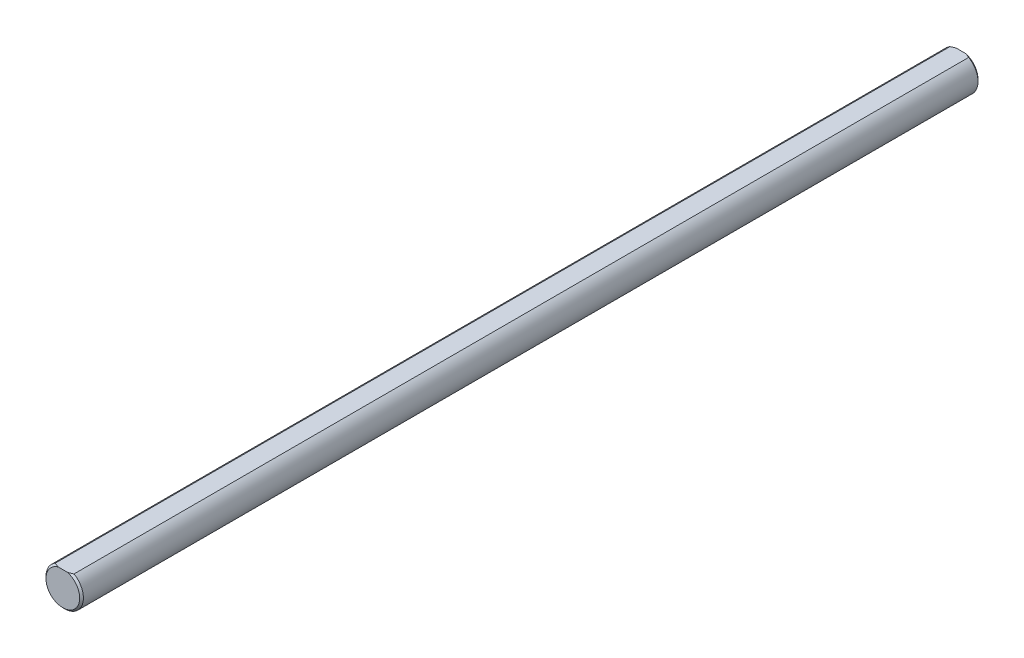
ISO-10303-21;
HEADER;
FILE_DESCRIPTION(('STEP AP214'),'2;1');
FILE_NAME('part.step','',(''),(''),'','','');
FILE_SCHEMA(('AUTOMOTIVE_DESIGN { 1 0 10303 214 1 1 1 1 }'));
ENDSEC;
DATA;
#1=APPLICATION_CONTEXT('core data for automotive mechanical design processes');
#2=APPLICATION_PROTOCOL_DEFINITION('international standard','automotive_design',2000,#1);
#3=PRODUCT_CONTEXT('',#1,'mechanical');
#4=PRODUCT('Part','Part','',(#3));
#5=PRODUCT_RELATED_PRODUCT_CATEGORY('part','',(#4));
#6=PRODUCT_DEFINITION_FORMATION('','',#4);
#7=PRODUCT_DEFINITION_CONTEXT('part definition',#1,'design');
#8=PRODUCT_DEFINITION('design','',#6,#7);
#9=PRODUCT_DEFINITION_SHAPE('','',#8);
#10=(LENGTH_UNIT() NAMED_UNIT(*) SI_UNIT(.MILLI.,.METRE.));
#11=(NAMED_UNIT(*) PLANE_ANGLE_UNIT() SI_UNIT($,.RADIAN.));
#12=(NAMED_UNIT(*) SI_UNIT($,.STERADIAN.) SOLID_ANGLE_UNIT());
#13=UNCERTAINTY_MEASURE_WITH_UNIT(LENGTH_MEASURE(1.E-05),#10,'distance_accuracy_value','');
#14=(GEOMETRIC_REPRESENTATION_CONTEXT(3) GLOBAL_UNCERTAINTY_ASSIGNED_CONTEXT((#13)) GLOBAL_UNIT_ASSIGNED_CONTEXT((#10,
#11,#12)) REPRESENTATION_CONTEXT('',''));
#15=CARTESIAN_POINT('',(0.,0.,0.));
#16=DIRECTION('',(0.,0.,1.));
#17=DIRECTION('',(1.,0.,0.));
#18=AXIS2_PLACEMENT_3D('',#15,#16,#17);
#19=CARTESIAN_POINT('',(0.,0.,76.2));
#20=DIRECTION('',(0.,0.,-1.));
#21=DIRECTION('',(-1.,0.,0.));
#22=AXIS2_PLACEMENT_3D('',#19,#20,#21);
#23=CYLINDRICAL_SURFACE('',#22,3.175);
#24=DIRECTION('',(0.,0.,1.));
#25=VECTOR('',#24,1.);
#26=CARTESIAN_POINT('',(-1.5875,2.74963065701559,-76.2));
#27=LINE('',#26,#25);
#28=CARTESIAN_POINT('',(-1.5875,2.74963065701559,-75.8824999999998));
#29=VERTEX_POINT('',#28);
#30=CARTESIAN_POINT('',(-1.5875,2.74963065701559,75.8825000000001));
#31=VERTEX_POINT('',#30);
#32=EDGE_CURVE('E81',#29,#31,#27,.T.);
#33=ORIENTED_EDGE('',*,*,#32,.F.);
#34=CARTESIAN_POINT('',(0.,0.,-75.8824999999998));
#35=DIRECTION('',(0.,0.,1.));
#36=DIRECTION('',(1.,0.,0.));
#37=AXIS2_PLACEMENT_3D('',#34,#35,#36);
#38=CIRCLE('',#37,3.175);
#39=CARTESIAN_POINT('',(1.5875,2.74963065701559,-75.8824999999998));
#40=VERTEX_POINT('',#39);
#41=EDGE_CURVE('E92',#29,#40,#38,.T.);
#42=ORIENTED_EDGE('',*,*,#41,.T.);
#43=DIRECTION('',(0.,0.,1.));
#44=VECTOR('',#43,1.);
#45=CARTESIAN_POINT('',(1.5875,2.74963065701559,-76.2));
#46=LINE('',#45,#44);
#47=CARTESIAN_POINT('',(1.5875,2.74963065701559,75.8825000000001));
#48=VERTEX_POINT('',#47);
#49=EDGE_CURVE('E94',#40,#48,#46,.T.);
#50=ORIENTED_EDGE('',*,*,#49,.T.);
#51=CARTESIAN_POINT('',(0.,0.,75.8825000000001));
#52=DIRECTION('',(0.,0.,1.));
#53=DIRECTION('',(1.,0.,0.));
#54=AXIS2_PLACEMENT_3D('',#51,#52,#53);
#55=CIRCLE('',#54,3.175);
#56=EDGE_CURVE('E93',#48,#31,#55,.F.);
#57=ORIENTED_EDGE('',*,*,#56,.T.);
#58=EDGE_LOOP('',(#33,#42,#50,#57));
#59=FACE_BOUND('',#58,.T.);
#60=ADVANCED_FACE('F34',(#59),#23,.T.);
#61=CARTESIAN_POINT('',(0.,0.,76.2));
#62=DIRECTION('',(0.,0.,1.));
#63=DIRECTION('',(1.,0.,0.));
#64=AXIS2_PLACEMENT_3D('',#61,#62,#63);
#65=PLANE('',#64);
#66=DIRECTION('',(1.,0.,0.));
#67=VECTOR('',#66,1.);
#68=CARTESIAN_POINT('',(-1.5875,2.74963065701559,76.2));
#69=LINE('',#68,#67);
#70=CARTESIAN_POINT('',(-0.777712993334062,2.74963065701559,76.2));
#71=VERTEX_POINT('',#70);
#72=CARTESIAN_POINT('',(0.777712993334062,2.74963065701559,76.2));
#73=VERTEX_POINT('',#72);
#74=EDGE_CURVE('E139',#71,#73,#69,.T.);
#75=ORIENTED_EDGE('',*,*,#74,.F.);
#76=CARTESIAN_POINT('',(0.,0.,76.2));
#77=DIRECTION('',(0.,0.,1.));
#78=DIRECTION('',(1.,0.,0.));
#79=AXIS2_PLACEMENT_3D('',#76,#77,#78);
#80=CIRCLE('',#79,2.85750000000011);
#81=EDGE_CURVE('E11',#71,#73,#80,.T.);
#82=ORIENTED_EDGE('',*,*,#81,.T.);
#83=EDGE_LOOP('',(#75,#82));
#84=FACE_BOUND('',#83,.T.);
#85=ADVANCED_FACE('F132',(#84),#65,.T.);
#86=CARTESIAN_POINT('',(0.,0.,-76.2));
#87=DIRECTION('',(0.,0.,1.));
#88=DIRECTION('',(1.,0.,0.));
#89=AXIS2_PLACEMENT_3D('',#86,#87,#88);
#90=PLANE('',#89);
#91=DIRECTION('',(1.,0.,0.));
#92=VECTOR('',#91,1.);
#93=CARTESIAN_POINT('',(-1.5875,2.74963065701559,-76.2));
#94=LINE('',#93,#92);
#95=CARTESIAN_POINT('',(-0.77771299333294,2.74963065701559,-76.2));
#96=VERTEX_POINT('',#95);
#97=CARTESIAN_POINT('',(0.77771299333294,2.74963065701559,-76.2));
#98=VERTEX_POINT('',#97);
#99=EDGE_CURVE('E83',#96,#98,#94,.T.);
#100=ORIENTED_EDGE('',*,*,#99,.T.);
#101=CARTESIAN_POINT('',(0.,0.,-76.2));
#102=DIRECTION('',(0.,0.,1.));
#103=DIRECTION('',(1.,0.,0.));
#104=AXIS2_PLACEMENT_3D('',#101,#102,#103);
#105=CIRCLE('',#104,2.8574999999998);
#106=EDGE_CURVE('E43',#98,#96,#105,.F.);
#107=ORIENTED_EDGE('',*,*,#106,.T.);
#108=EDGE_LOOP('',(#100,#107));
#109=FACE_BOUND('',#108,.T.);
#110=ADVANCED_FACE('F113',(#109),#90,.F.);
#111=CARTESIAN_POINT('',(-1.5875,2.74963065701559,-76.2));
#112=DIRECTION('',(0.,-1.,0.));
#113=DIRECTION('',(0.,0.,-1.));
#114=AXIS2_PLACEMENT_3D('',#111,#112,#113);
#115=PLANE('',#114);
#116=ORIENTED_EDGE('',*,*,#49,.F.);
#117=CARTESIAN_POINT('',(1.5875,2.74963065701559,-75.8824999999998));
#118=CARTESIAN_POINT('',(1.52250516699264,2.74963065701559,-75.9149880824797));
#119=CARTESIAN_POINT('',(1.45690188238018,2.74963065701559,-75.9463019076192));
#120=CARTESIAN_POINT('',(1.32458227076999,2.74963065701559,-76.0060258514251));
#121=CARTESIAN_POINT('',(1.25786903887704,2.74963065701559,-76.0344428470168));
#122=CARTESIAN_POINT('',(1.12308918002457,2.74963065701559,-76.0879920057044));
#123=CARTESIAN_POINT('',(1.05502199036131,2.74963065701559,-76.1131227687341));
#124=CARTESIAN_POINT('',(0.917422256787398,2.74963065701559,-76.1595821959476));
#125=CARTESIAN_POINT('',(0.84788654327487,2.74963065701559,-76.1809014355307));
#126=CARTESIAN_POINT('',(0.777712993332939,2.74963065701559,-76.2));
#127=B_SPLINE_CURVE_WITH_KNOTS('',3,(#117,#118,#119,#120,#121,#122,#123,#124,#125,#126),
.UNSPECIFIED.,.F.,.F.,(4,2,2,2,4),(0.,0.218002568777967,0.435474929897523,0.653039643131099,
0.871135095681305),.UNSPECIFIED.);
#128=EDGE_CURVE('E87',#40,#98,#127,.T.);
#129=ORIENTED_EDGE('',*,*,#128,.T.);
#130=ORIENTED_EDGE('',*,*,#99,.F.);
#131=CARTESIAN_POINT('',(-0.77771299333294,2.74963065701559,-76.2));
#132=CARTESIAN_POINT('',(-0.847886543274871,2.74963065701559,-76.1809014355307));
#133=CARTESIAN_POINT('',(-0.917422256787399,2.74963065701559,-76.1595821959476));
#134=CARTESIAN_POINT('',(-1.05502199036131,2.74963065701559,-76.1131227687341));
#135=CARTESIAN_POINT('',(-1.12308918002457,2.74963065701559,-76.0879920057044));
#136=CARTESIAN_POINT('',(-1.25786903887704,2.74963065701559,-76.0344428470168));
#137=CARTESIAN_POINT('',(-1.32458227076999,2.74963065701559,-76.0060258514251));
#138=CARTESIAN_POINT('',(-1.45690188238018,2.74963065701559,-75.9463019076192));
#139=CARTESIAN_POINT('',(-1.52250516699264,2.74963065701559,-75.9149880824797));
#140=CARTESIAN_POINT('',(-1.5875,2.74963065701559,-75.8824999999998));
#141=B_SPLINE_CURVE_WITH_KNOTS('',3,(#131,#132,#133,#134,#135,#136,#137,#138,#139,#140),
.UNSPECIFIED.,.F.,.F.,(4,2,2,2,4),(0.,0.218095452550206,0.435660165783782,0.653132526903341,
0.871135095681305),.UNSPECIFIED.);
#142=EDGE_CURVE('E77',#96,#29,#141,.T.);
#143=ORIENTED_EDGE('',*,*,#142,.T.);
#144=ORIENTED_EDGE('',*,*,#32,.T.);
#145=CARTESIAN_POINT('',(-1.5875,2.74963065701559,75.8825000000001));
#146=CARTESIAN_POINT('',(-1.52250516699273,2.74963065701559,75.91498808248));
#147=CARTESIAN_POINT('',(-1.45690188238036,2.74963065701559,75.9463019076195));
#148=CARTESIAN_POINT('',(-1.32458227077035,2.74963065701559,76.0060258514252));
#149=CARTESIAN_POINT('',(-1.25786903887749,2.74963065701559,76.0344428470169));
#150=CARTESIAN_POINT('',(-1.12308918002521,2.74963065701559,76.0879920057045));
#151=CARTESIAN_POINT('',(-1.05502199036204,2.74963065701559,76.1131227687342));
#152=CARTESIAN_POINT('',(-0.91742225678832,2.74963065701559,76.1595821959476));
#153=CARTESIAN_POINT('',(-0.847886543275889,2.74963065701559,76.1809014355307));
#154=CARTESIAN_POINT('',(-0.777712993334062,2.74963065701559,76.2));
#155=B_SPLINE_CURVE_WITH_KNOTS('',3,(#145,#146,#147,#148,#149,#150,#151,#152,#153,#154),
.UNSPECIFIED.,.F.,.F.,(4,2,2,2,4),(0.,0.218002568777676,0.435474929896942,0.653039643130223,
0.871135095680142),.UNSPECIFIED.);
#156=EDGE_CURVE('E57',#31,#71,#155,.T.);
#157=ORIENTED_EDGE('',*,*,#156,.T.);
#158=ORIENTED_EDGE('',*,*,#74,.T.);
#159=CARTESIAN_POINT('',(0.777712993334062,2.74963065701559,76.2));
#160=CARTESIAN_POINT('',(0.847886543275889,2.74963065701559,76.1809014355307));
#161=CARTESIAN_POINT('',(0.917422256788319,2.74963065701559,76.1595821959476));
#162=CARTESIAN_POINT('',(1.05502199036204,2.74963065701559,76.1131227687342));
#163=CARTESIAN_POINT('',(1.12308918002521,2.74963065701559,76.0879920057045));
#164=CARTESIAN_POINT('',(1.25786903887749,2.74963065701559,76.0344428470169));
#165=CARTESIAN_POINT('',(1.32458227077035,2.74963065701559,76.0060258514252));
#166=CARTESIAN_POINT('',(1.45690188238036,2.74963065701559,75.9463019076195));
#167=CARTESIAN_POINT('',(1.52250516699273,2.74963065701559,75.91498808248));
#168=CARTESIAN_POINT('',(1.5875,2.74963065701559,75.8825000000001));
#169=B_SPLINE_CURVE_WITH_KNOTS('',3,(#159,#160,#161,#162,#163,#164,#165,#166,#167,#168),
.UNSPECIFIED.,.F.,.F.,(4,2,2,2,4),(0.,0.21809545254992,0.4356601657832,0.653132526902467,
0.871135095680142),.UNSPECIFIED.);
#170=EDGE_CURVE('E50',#73,#48,#169,.T.);
#171=ORIENTED_EDGE('',*,*,#170,.T.);
#172=EDGE_LOOP('',(#116,#129,#130,#143,#144,#157,#158,#171));
#173=FACE_BOUND('',#172,.T.);
#174=ADVANCED_FACE('F80',(#173),#115,.F.);
#175=CARTESIAN_POINT('',(0.,0.,-75.8824999999998));
#176=DIRECTION('',(0.,0.,1.));
#177=DIRECTION('',(1.,0.,0.));
#178=AXIS2_PLACEMENT_3D('',#175,#176,#177);
#179=CONICAL_SURFACE('',#178,3.175,0.785398163397453);
#180=ORIENTED_EDGE('',*,*,#142,.F.);
#181=ORIENTED_EDGE('',*,*,#106,.F.);
#182=ORIENTED_EDGE('',*,*,#128,.F.);
#183=ORIENTED_EDGE('',*,*,#41,.F.);
#184=EDGE_LOOP('',(#180,#181,#182,#183));
#185=FACE_BOUND('',#184,.T.);
#186=ADVANCED_FACE('F96',(#185),#179,.T.);
#187=CARTESIAN_POINT('',(0.,0.,76.2));
#188=DIRECTION('',(0.,0.,-1.));
#189=DIRECTION('',(-1.,0.,0.));
#190=AXIS2_PLACEMENT_3D('',#187,#188,#189);
#191=CONICAL_SURFACE('',#190,2.85750000000011,0.785398163397453);
#192=ORIENTED_EDGE('',*,*,#156,.F.);
#193=ORIENTED_EDGE('',*,*,#56,.F.);
#194=ORIENTED_EDGE('',*,*,#170,.F.);
#195=ORIENTED_EDGE('',*,*,#81,.F.);
#196=EDGE_LOOP('',(#192,#193,#194,#195));
#197=FACE_BOUND('',#196,.T.);
#198=ADVANCED_FACE('F36',(#197),#191,.T.);
#199=CLOSED_SHELL('',(#60,#85,#110,#174,#186,#198));
#200=MANIFOLD_SOLID_BREP('B2',#199);
#201=ADVANCED_BREP_SHAPE_REPRESENTATION('',(#18,#200),#14);
#202=SHAPE_DEFINITION_REPRESENTATION(#9,#201);
ENDSEC;
END-ISO-10303-21;
